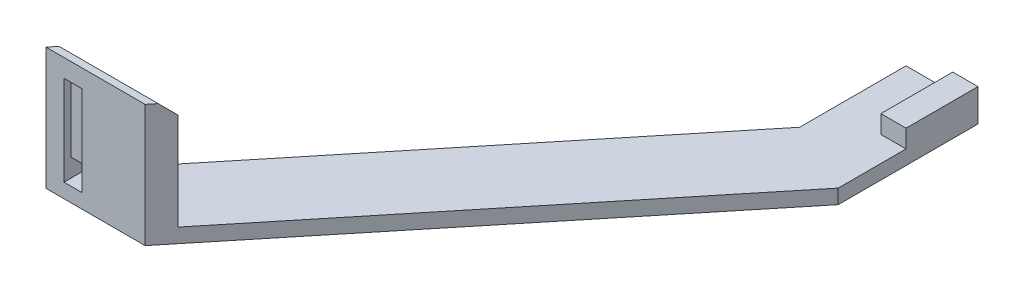
ISO-10303-21;
HEADER;
FILE_DESCRIPTION(('STEP AP214'),'2;1');
FILE_NAME('part.step','',(''),(''),'','','');
FILE_SCHEMA(('AUTOMOTIVE_DESIGN { 1 0 10303 214 1 1 1 1 }'));
ENDSEC;
DATA;
#1=APPLICATION_CONTEXT('core data for automotive mechanical design processes');
#2=APPLICATION_PROTOCOL_DEFINITION('international standard','automotive_design',2000,#1);
#3=PRODUCT_CONTEXT('',#1,'mechanical');
#4=PRODUCT('Part','Part','',(#3));
#5=PRODUCT_RELATED_PRODUCT_CATEGORY('part','',(#4));
#6=PRODUCT_DEFINITION_FORMATION('','',#4);
#7=PRODUCT_DEFINITION_CONTEXT('part definition',#1,'design');
#8=PRODUCT_DEFINITION('design','',#6,#7);
#9=PRODUCT_DEFINITION_SHAPE('','',#8);
#10=(LENGTH_UNIT() NAMED_UNIT(*) SI_UNIT(.MILLI.,.METRE.));
#11=(NAMED_UNIT(*) PLANE_ANGLE_UNIT() SI_UNIT($,.RADIAN.));
#12=(NAMED_UNIT(*) SI_UNIT($,.STERADIAN.) SOLID_ANGLE_UNIT());
#13=UNCERTAINTY_MEASURE_WITH_UNIT(LENGTH_MEASURE(1.E-05),#10,'distance_accuracy_value','');
#14=(GEOMETRIC_REPRESENTATION_CONTEXT(3) GLOBAL_UNCERTAINTY_ASSIGNED_CONTEXT((#13)) GLOBAL_UNIT_ASSIGNED_CONTEXT((#10,
#11,#12)) REPRESENTATION_CONTEXT('',''));
#15=CARTESIAN_POINT('',(0.,0.,0.));
#16=DIRECTION('',(0.,0.,1.));
#17=DIRECTION('',(1.,0.,0.));
#18=AXIS2_PLACEMENT_3D('',#15,#16,#17);
#19=CARTESIAN_POINT('',(-109.,34.,0.));
#20=DIRECTION('',(-1.,0.,0.));
#21=DIRECTION('',(0.,0.,1.));
#22=AXIS2_PLACEMENT_3D('',#19,#20,#21);
#23=PLANE('',#22);
#24=DIRECTION('',(0.,0.,-1.));
#25=VECTOR('',#24,1.);
#26=CARTESIAN_POINT('',(-109.,29.,0.));
#27=LINE('',#26,#25);
#28=CARTESIAN_POINT('',(-109.,29.,0.));
#29=VERTEX_POINT('',#28);
#30=CARTESIAN_POINT('',(-109.,29.,-2.));
#31=VERTEX_POINT('',#30);
#32=EDGE_CURVE('E158',#29,#31,#27,.T.);
#33=ORIENTED_EDGE('',*,*,#32,.F.);
#34=DIRECTION('',(0.,-1.,0.));
#35=VECTOR('',#34,1.);
#36=CARTESIAN_POINT('',(-109.,34.,0.));
#37=LINE('',#36,#35);
#38=CARTESIAN_POINT('',(-109.,4.,0.));
#39=VERTEX_POINT('',#38);
#40=EDGE_CURVE('E169',#29,#39,#37,.T.);
#41=ORIENTED_EDGE('',*,*,#40,.T.);
#42=DIRECTION('',(0.,0.,-1.));
#43=VECTOR('',#42,1.);
#44=CARTESIAN_POINT('',(-109.,4.,0.));
#45=LINE('',#44,#43);
#46=CARTESIAN_POINT('',(-109.,4.,-5.));
#47=VERTEX_POINT('',#46);
#48=EDGE_CURVE('E248',#39,#47,#45,.T.);
#49=ORIENTED_EDGE('',*,*,#48,.T.);
#50=DIRECTION('',(0.,-1.,0.));
#51=VECTOR('',#50,1.);
#52=CARTESIAN_POINT('',(-109.,34.,-5.));
#53=LINE('',#52,#51);
#54=CARTESIAN_POINT('',(-109.,9.,-5.));
#55=VERTEX_POINT('',#54);
#56=EDGE_CURVE('E220',#55,#47,#53,.T.);
#57=ORIENTED_EDGE('',*,*,#56,.F.);
#58=DIRECTION('',(0.,0.,1.));
#59=VECTOR('',#58,1.);
#60=CARTESIAN_POINT('',(-109.,9.,-32.));
#61=LINE('',#60,#59);
#62=CARTESIAN_POINT('',(-109.,9.,-2.));
#63=VERTEX_POINT('',#62);
#64=EDGE_CURVE('E251',#55,#63,#61,.T.);
#65=ORIENTED_EDGE('',*,*,#64,.T.);
#66=DIRECTION('',(0.,-1.,0.));
#67=VECTOR('',#66,1.);
#68=CARTESIAN_POINT('',(-109.,34.,-2.));
#69=LINE('',#68,#67);
#70=EDGE_CURVE('E172',#31,#63,#69,.T.);
#71=ORIENTED_EDGE('',*,*,#70,.F.);
#72=EDGE_LOOP('',(#33,#41,#49,#57,#65,#71));
#73=FACE_BOUND('',#72,.T.);
#74=ADVANCED_FACE('F33',(#73),#23,.F.);
#75=CARTESIAN_POINT('',(-109.,34.,-2.));
#76=DIRECTION('',(0.,0.,-1.));
#77=DIRECTION('',(-1.,0.,0.));
#78=AXIS2_PLACEMENT_3D('',#75,#76,#77);
#79=PLANE('',#78);
#80=DIRECTION('',(1.,0.,0.));
#81=VECTOR('',#80,1.);
#82=CARTESIAN_POINT('',(-104.,29.,-2.));
#83=LINE('',#82,#81);
#84=CARTESIAN_POINT('',(-104.,29.,-2.));
#85=VERTEX_POINT('',#84);
#86=EDGE_CURVE('E165',#31,#85,#83,.T.);
#87=ORIENTED_EDGE('',*,*,#86,.F.);
#88=ORIENTED_EDGE('',*,*,#70,.T.);
#89=DIRECTION('',(-1.,0.,0.));
#90=VECTOR('',#89,1.);
#91=CARTESIAN_POINT('',(-109.,9.,-2.));
#92=LINE('',#91,#90);
#93=CARTESIAN_POINT('',(-104.,9.,-2.));
#94=VERTEX_POINT('',#93);
#95=EDGE_CURVE('E173',#94,#63,#92,.T.);
#96=ORIENTED_EDGE('',*,*,#95,.F.);
#97=DIRECTION('',(0.,-1.,0.));
#98=VECTOR('',#97,1.);
#99=CARTESIAN_POINT('',(-104.,34.,-2.));
#100=LINE('',#99,#98);
#101=EDGE_CURVE('E185',#85,#94,#100,.T.);
#102=ORIENTED_EDGE('',*,*,#101,.F.);
#103=EDGE_LOOP('',(#87,#88,#96,#102));
#104=FACE_BOUND('',#103,.T.);
#105=ADVANCED_FACE('F274',(#104),#79,.F.);
#106=CARTESIAN_POINT('',(-104.,34.,-2.));
#107=DIRECTION('',(1.,0.,0.));
#108=DIRECTION('',(0.,0.,-1.));
#109=AXIS2_PLACEMENT_3D('',#106,#107,#108);
#110=PLANE('',#109);
#111=DIRECTION('',(0.,0.,-1.));
#112=VECTOR('',#111,1.);
#113=CARTESIAN_POINT('',(-104.,29.,0.));
#114=LINE('',#113,#112);
#115=CARTESIAN_POINT('',(-104.,29.,0.));
#116=VERTEX_POINT('',#115);
#117=EDGE_CURVE('E161',#116,#85,#114,.T.);
#118=ORIENTED_EDGE('',*,*,#117,.T.);
#119=ORIENTED_EDGE('',*,*,#101,.T.);
#120=DIRECTION('',(0.,0.,1.));
#121=VECTOR('',#120,1.);
#122=CARTESIAN_POINT('',(-104.,9.,-32.));
#123=LINE('',#122,#121);
#124=CARTESIAN_POINT('',(-104.,9.,-5.));
#125=VERTEX_POINT('',#124);
#126=EDGE_CURVE('E266',#125,#94,#123,.T.);
#127=ORIENTED_EDGE('',*,*,#126,.F.);
#128=DIRECTION('',(0.,1.,0.));
#129=VECTOR('',#128,1.);
#130=CARTESIAN_POINT('',(-104.,34.,-5.));
#131=LINE('',#130,#129);
#132=CARTESIAN_POINT('',(-104.,4.,-5.));
#133=VERTEX_POINT('',#132);
#134=EDGE_CURVE('E213',#133,#125,#131,.T.);
#135=ORIENTED_EDGE('',*,*,#134,.F.);
#136=DIRECTION('',(0.,0.,1.));
#137=VECTOR('',#136,1.);
#138=CARTESIAN_POINT('',(-104.,4.,-2.));
#139=LINE('',#138,#137);
#140=CARTESIAN_POINT('',(-104.,4.,0.));
#141=VERTEX_POINT('',#140);
#142=EDGE_CURVE('E250',#133,#141,#139,.T.);
#143=ORIENTED_EDGE('',*,*,#142,.T.);
#144=DIRECTION('',(0.,-1.,0.));
#145=VECTOR('',#144,1.);
#146=CARTESIAN_POINT('',(-104.,34.,0.));
#147=LINE('',#146,#145);
#148=EDGE_CURVE('E259',#116,#141,#147,.T.);
#149=ORIENTED_EDGE('',*,*,#148,.F.);
#150=EDGE_LOOP('',(#118,#119,#127,#135,#143,#149));
#151=FACE_BOUND('',#150,.T.);
#152=ADVANCED_FACE('F264',(#151),#110,.F.);
#153=CARTESIAN_POINT('',(0.,4.,0.));
#154=DIRECTION('',(0.,-1.,0.));
#155=DIRECTION('',(0.,0.,-1.));
#156=AXIS2_PLACEMENT_3D('',#153,#154,#155);
#157=PLANE('',#156);
#158=DIRECTION('',(-0.631426343209567,0.,0.775435860081925));
#159=VECTOR('',#158,1.);
#160=CARTESIAN_POINT('',(-114.,4.,0.));
#161=LINE('',#160,#159);
#162=CARTESIAN_POINT('',(-20.,4.,-115.438596491228));
#163=VERTEX_POINT('',#162);
#164=CARTESIAN_POINT('',(-109.928571428571,4.,-5.));
#165=VERTEX_POINT('',#164);
#166=EDGE_CURVE('E497',#163,#165,#161,.T.);
#167=ORIENTED_EDGE('',*,*,#166,.T.);
#168=DIRECTION('',(-1.,0.,0.));
#169=VECTOR('',#168,1.);
#170=CARTESIAN_POINT('',(-82.3748336188116,4.,-5.));
#171=LINE('',#170,#169);
#172=EDGE_CURVE('E254',#47,#165,#171,.T.);
#173=ORIENTED_EDGE('',*,*,#172,.F.);
#174=ORIENTED_EDGE('',*,*,#48,.F.);
#175=DIRECTION('',(1.,0.,0.));
#176=VECTOR('',#175,1.);
#177=CARTESIAN_POINT('',(-114.,4.,0.));
#178=LINE('',#177,#176);
#179=EDGE_CURVE('E179',#39,#141,#178,.T.);
#180=ORIENTED_EDGE('',*,*,#179,.T.);
#181=ORIENTED_EDGE('',*,*,#142,.F.);
#182=CARTESIAN_POINT('',(-82.3748336188116,4.,-5.));
#183=VERTEX_POINT('',#182);
#184=EDGE_CURVE('E255',#183,#133,#171,.T.);
#185=ORIENTED_EDGE('',*,*,#184,.F.);
#186=DIRECTION('',(0.631434001711775,0.,-0.775429623810088));
#187=VECTOR('',#186,1.);
#188=CARTESIAN_POINT('',(-86.4463443163861,4.,0.));
#189=LINE('',#188,#187);
#190=CARTESIAN_POINT('',(0.,4.,-106.160035841102));
#191=VERTEX_POINT('',#190);
#192=EDGE_CURVE('E502',#183,#191,#189,.T.);
#193=ORIENTED_EDGE('',*,*,#192,.T.);
#194=DIRECTION('',(0.,0.,-1.));
#195=VECTOR('',#194,1.);
#196=CARTESIAN_POINT('',(0.,4.,-140.));
#197=LINE('',#196,#195);
#198=CARTESIAN_POINT('',(0.,4.,-125.));
#199=VERTEX_POINT('',#198);
#200=EDGE_CURVE('E508',#191,#199,#197,.T.);
#201=ORIENTED_EDGE('',*,*,#200,.T.);
#202=DIRECTION('',(1.,0.,0.));
#203=VECTOR('',#202,1.);
#204=CARTESIAN_POINT('',(0.,4.,-125.));
#205=LINE('',#204,#203);
#206=CARTESIAN_POINT('',(-7.,4.,-125.));
#207=VERTEX_POINT('',#206);
#208=EDGE_CURVE('E183',#207,#199,#205,.T.);
#209=ORIENTED_EDGE('',*,*,#208,.F.);
#210=DIRECTION('',(0.,0.,1.));
#211=VECTOR('',#210,1.);
#212=CARTESIAN_POINT('',(-7.,4.,-145.));
#213=LINE('',#212,#211);
#214=CARTESIAN_POINT('',(-7.,4.,-145.));
#215=VERTEX_POINT('',#214);
#216=EDGE_CURVE('E180',#215,#207,#213,.T.);
#217=ORIENTED_EDGE('',*,*,#216,.F.);
#218=DIRECTION('',(-1.,0.,0.));
#219=VECTOR('',#218,1.);
#220=CARTESIAN_POINT('',(-20.,4.,-145.));
#221=LINE('',#220,#219);
#222=CARTESIAN_POINT('',(-20.,4.,-145.));
#223=VERTEX_POINT('',#222);
#224=EDGE_CURVE('E516',#215,#223,#221,.T.);
#225=ORIENTED_EDGE('',*,*,#224,.T.);
#226=DIRECTION('',(0.,0.,1.));
#227=VECTOR('',#226,1.);
#228=CARTESIAN_POINT('',(-20.,4.,-145.));
#229=LINE('',#228,#227);
#230=EDGE_CURVE('E499',#223,#163,#229,.T.);
#231=ORIENTED_EDGE('',*,*,#230,.T.);
#232=EDGE_LOOP('',(#167,#173,#174,#180,#181,#185,#193,#201,#209,#217,#225,#231));
#233=FACE_BOUND('',#232,.T.);
#234=ADVANCED_FACE('F317',(#233),#157,.F.);
#235=CARTESIAN_POINT('',(-114.,4.,0.));
#236=DIRECTION('',(0.775435860081925,0.,0.631426343209567));
#237=DIRECTION('',(0.631426343209567,0.,-0.775435860081925));
#238=AXIS2_PLACEMENT_3D('',#235,#236,#237);
#239=PLANE('',#238);
#240=DIRECTION('',(-0.631426343209566,0.,0.775435860081925));
#241=VECTOR('',#240,1.);
#242=CARTESIAN_POINT('',(-109.928571428571,34.,-5.));
#243=LINE('',#242,#241);
#244=CARTESIAN_POINT('',(-112.371428571429,34.,-1.99999999999995));
#245=VERTEX_POINT('',#244);
#246=CARTESIAN_POINT('',(-114.,34.,0.));
#247=VERTEX_POINT('',#246);
#248=EDGE_CURVE('E230',#245,#247,#243,.T.);
#249=ORIENTED_EDGE('',*,*,#248,.F.);
#250=DIRECTION('',(0.498983563377396,-0.612786832217861,-0.612786832217856));
#251=VECTOR('',#250,1.);
#252=CARTESIAN_POINT('',(-84.3926737681051,-0.359874319871327,-36.359874319871));
#253=LINE('',#252,#251);
#254=CARTESIAN_POINT('',(-109.928571428571,30.9999999999999,-5.));
#255=VERTEX_POINT('',#254);
#256=EDGE_CURVE('E55',#245,#255,#253,.T.);
#257=ORIENTED_EDGE('',*,*,#256,.T.);
#258=DIRECTION('',(0.,-1.,0.));
#259=VECTOR('',#258,1.);
#260=CARTESIAN_POINT('',(-109.928571428571,34.,-5.));
#261=LINE('',#260,#259);
#262=EDGE_CURVE('E240',#255,#165,#261,.T.);
#263=ORIENTED_EDGE('',*,*,#262,.T.);
#264=ORIENTED_EDGE('',*,*,#166,.F.);
#265=DIRECTION('',(0.,-1.,0.));
#266=VECTOR('',#265,1.);
#267=CARTESIAN_POINT('',(-20.,4.,-115.438596491228));
#268=LINE('',#267,#266);
#269=CARTESIAN_POINT('',(-20.,0.,-115.438596491228));
#270=VERTEX_POINT('',#269);
#271=EDGE_CURVE('E538',#163,#270,#268,.T.);
#272=ORIENTED_EDGE('',*,*,#271,.T.);
#273=DIRECTION('',(-0.631426343209567,0.,0.775435860081925));
#274=VECTOR('',#273,1.);
#275=CARTESIAN_POINT('',(-114.,0.,0.));
#276=LINE('',#275,#274);
#277=CARTESIAN_POINT('',(-114.,0.,0.));
#278=VERTEX_POINT('',#277);
#279=EDGE_CURVE('E521',#270,#278,#276,.T.);
#280=ORIENTED_EDGE('',*,*,#279,.T.);
#281=DIRECTION('',(0.,-1.,0.));
#282=VECTOR('',#281,1.);
#283=CARTESIAN_POINT('',(-114.,4.,0.));
#284=LINE('',#283,#282);
#285=EDGE_CURVE('E217',#247,#278,#284,.T.);
#286=ORIENTED_EDGE('',*,*,#285,.F.);
#287=EDGE_LOOP('',(#249,#257,#263,#264,#272,#280,#286));
#288=FACE_BOUND('',#287,.T.);
#289=ADVANCED_FACE('F236',(#288),#239,.F.);
#290=CARTESIAN_POINT('',(-114.,4.,0.));
#291=DIRECTION('',(0.,0.,-1.));
#292=DIRECTION('',(-1.,0.,0.));
#293=AXIS2_PLACEMENT_3D('',#290,#291,#292);
#294=PLANE('',#293);
#295=ORIENTED_EDGE('',*,*,#40,.F.);
#296=DIRECTION('',(1.,0.,0.));
#297=VECTOR('',#296,1.);
#298=CARTESIAN_POINT('',(-104.,29.,0.));
#299=LINE('',#298,#297);
#300=EDGE_CURVE('E155',#29,#116,#299,.T.);
#301=ORIENTED_EDGE('',*,*,#300,.T.);
#302=ORIENTED_EDGE('',*,*,#148,.T.);
#303=ORIENTED_EDGE('',*,*,#179,.F.);
#304=EDGE_LOOP('',(#295,#301,#302,#303));
#305=FACE_BOUND('',#304,.T.);
#306=DIRECTION('',(1.,0.,0.));
#307=VECTOR('',#306,1.);
#308=CARTESIAN_POINT('',(-114.,0.,0.));
#309=LINE('',#308,#307);
#310=CARTESIAN_POINT('',(-86.4463443163861,0.,0.));
#311=VERTEX_POINT('',#310);
#312=EDGE_CURVE('E281',#278,#311,#309,.T.);
#313=ORIENTED_EDGE('',*,*,#312,.T.);
#314=DIRECTION('',(0.,-1.,0.));
#315=VECTOR('',#314,1.);
#316=CARTESIAN_POINT('',(-86.4463443163861,4.,0.));
#317=LINE('',#316,#315);
#318=CARTESIAN_POINT('',(-86.4463443163861,34.,0.));
#319=VERTEX_POINT('',#318);
#320=EDGE_CURVE('E280',#319,#311,#317,.T.);
#321=ORIENTED_EDGE('',*,*,#320,.F.);
#322=DIRECTION('',(1.,0.,0.));
#323=VECTOR('',#322,1.);
#324=CARTESIAN_POINT('',(-109.,34.,0.));
#325=LINE('',#324,#323);
#326=EDGE_CURVE('E244',#247,#319,#325,.T.);
#327=ORIENTED_EDGE('',*,*,#326,.F.);
#328=ORIENTED_EDGE('',*,*,#285,.T.);
#329=EDGE_LOOP('',(#313,#321,#327,#328));
#330=FACE_BOUND('',#329,.T.);
#331=ADVANCED_FACE('F176',(#305,#330),#294,.F.);
#332=CARTESIAN_POINT('',(-86.4463443163861,4.,0.));
#333=DIRECTION('',(-0.775429623810088,0.,-0.631434001711775));
#334=DIRECTION('',(-0.631434001711775,0.,0.775429623810088));
#335=AXIS2_PLACEMENT_3D('',#332,#333,#334);
#336=PLANE('',#335);
#337=DIRECTION('',(0.,-1.,0.));
#338=VECTOR('',#337,1.);
#339=CARTESIAN_POINT('',(-82.3748336188116,34.,-5.));
#340=LINE('',#339,#338);
#341=CARTESIAN_POINT('',(-82.3748336188116,30.9999999999999,-5.));
#342=VERTEX_POINT('',#341);
#343=EDGE_CURVE('E242',#342,#183,#340,.T.);
#344=ORIENTED_EDGE('',*,*,#343,.F.);
#345=DIRECTION('',(-0.498991122413766,0.612783754579157,0.612783754579151));
#346=VECTOR('',#345,1.);
#347=CARTESIAN_POINT('',(-63.6987894144777,8.06496974764141,-27.9350302523583));
#348=LINE('',#347,#346);
#349=CARTESIAN_POINT('',(-84.8177400373563,34.,-1.99999999999999));
#350=VERTEX_POINT('',#349);
#351=EDGE_CURVE('E11',#342,#350,#348,.T.);
#352=ORIENTED_EDGE('',*,*,#351,.T.);
#353=DIRECTION('',(0.631434001711776,0.,-0.775429623810087));
#354=VECTOR('',#353,1.);
#355=CARTESIAN_POINT('',(-86.4463443163861,34.,0.));
#356=LINE('',#355,#354);
#357=EDGE_CURVE('E233',#319,#350,#356,.T.);
#358=ORIENTED_EDGE('',*,*,#357,.F.);
#359=ORIENTED_EDGE('',*,*,#320,.T.);
#360=DIRECTION('',(0.631434001711775,0.,-0.775429623810088));
#361=VECTOR('',#360,1.);
#362=CARTESIAN_POINT('',(-86.4463443163861,0.,0.));
#363=LINE('',#362,#361);
#364=CARTESIAN_POINT('',(0.,0.,-106.160035841102));
#365=VERTEX_POINT('',#364);
#366=EDGE_CURVE('E543',#311,#365,#363,.T.);
#367=ORIENTED_EDGE('',*,*,#366,.T.);
#368=DIRECTION('',(0.,-1.,0.));
#369=VECTOR('',#368,1.);
#370=CARTESIAN_POINT('',(0.,4.,-106.160035841102));
#371=LINE('',#370,#369);
#372=EDGE_CURVE('E285',#191,#365,#371,.T.);
#373=ORIENTED_EDGE('',*,*,#372,.F.);
#374=ORIENTED_EDGE('',*,*,#192,.F.);
#375=EDGE_LOOP('',(#344,#352,#358,#359,#367,#373,#374));
#376=FACE_BOUND('',#375,.T.);
#377=ADVANCED_FACE('F287',(#376),#336,.F.);
#378=CARTESIAN_POINT('',(0.,4.,-145.));
#379=DIRECTION('',(-1.,0.,0.));
#380=DIRECTION('',(0.,0.,1.));
#381=AXIS2_PLACEMENT_3D('',#378,#379,#380);
#382=PLANE('',#381);
#383=DIRECTION('',(0.,0.,-1.));
#384=VECTOR('',#383,1.);
#385=CARTESIAN_POINT('',(0.,0.,-145.));
#386=LINE('',#385,#384);
#387=CARTESIAN_POINT('',(0.,0.,-145.));
#388=VERTEX_POINT('',#387);
#389=EDGE_CURVE('E545',#365,#388,#386,.T.);
#390=ORIENTED_EDGE('',*,*,#389,.T.);
#391=DIRECTION('',(0.,-1.,0.));
#392=VECTOR('',#391,1.);
#393=CARTESIAN_POINT('',(0.,4.,-145.));
#394=LINE('',#393,#392);
#395=CARTESIAN_POINT('',(0.,9.,-145.));
#396=VERTEX_POINT('',#395);
#397=EDGE_CURVE('E537',#396,#388,#394,.T.);
#398=ORIENTED_EDGE('',*,*,#397,.F.);
#399=DIRECTION('',(0.,0.,-1.));
#400=VECTOR('',#399,1.);
#401=CARTESIAN_POINT('',(0.,9.,-145.));
#402=LINE('',#401,#400);
#403=CARTESIAN_POINT('',(0.,9.,-125.));
#404=VERTEX_POINT('',#403);
#405=EDGE_CURVE('E189',#404,#396,#402,.T.);
#406=ORIENTED_EDGE('',*,*,#405,.F.);
#407=DIRECTION('',(0.,-1.,0.));
#408=VECTOR('',#407,1.);
#409=CARTESIAN_POINT('',(0.,9.,-125.));
#410=LINE('',#409,#408);
#411=EDGE_CURVE('E198',#404,#199,#410,.T.);
#412=ORIENTED_EDGE('',*,*,#411,.T.);
#413=ORIENTED_EDGE('',*,*,#200,.F.);
#414=ORIENTED_EDGE('',*,*,#372,.T.);
#415=EDGE_LOOP('',(#390,#398,#406,#412,#413,#414));
#416=FACE_BOUND('',#415,.T.);
#417=ADVANCED_FACE('F331',(#416),#382,.F.);
#418=CARTESIAN_POINT('',(-20.,4.,-145.));
#419=DIRECTION('',(0.,0.,1.));
#420=DIRECTION('',(1.,0.,0.));
#421=AXIS2_PLACEMENT_3D('',#418,#419,#420);
#422=PLANE('',#421);
#423=DIRECTION('',(-1.,0.,0.));
#424=VECTOR('',#423,1.);
#425=CARTESIAN_POINT('',(-20.,0.,-145.));
#426=LINE('',#425,#424);
#427=CARTESIAN_POINT('',(-20.,0.,-145.));
#428=VERTEX_POINT('',#427);
#429=EDGE_CURVE('E504',#388,#428,#426,.T.);
#430=ORIENTED_EDGE('',*,*,#429,.T.);
#431=DIRECTION('',(0.,-1.,0.));
#432=VECTOR('',#431,1.);
#433=CARTESIAN_POINT('',(-20.,4.,-145.));
#434=LINE('',#433,#432);
#435=EDGE_CURVE('E533',#223,#428,#434,.T.);
#436=ORIENTED_EDGE('',*,*,#435,.F.);
#437=ORIENTED_EDGE('',*,*,#224,.F.);
#438=DIRECTION('',(0.,-1.,0.));
#439=VECTOR('',#438,1.);
#440=CARTESIAN_POINT('',(-7.,9.,-145.));
#441=LINE('',#440,#439);
#442=CARTESIAN_POINT('',(-7.,9.,-145.));
#443=VERTEX_POINT('',#442);
#444=EDGE_CURVE('E519',#443,#215,#441,.T.);
#445=ORIENTED_EDGE('',*,*,#444,.F.);
#446=DIRECTION('',(-1.,0.,0.));
#447=VECTOR('',#446,1.);
#448=CARTESIAN_POINT('',(0.,9.,-145.));
#449=LINE('',#448,#447);
#450=EDGE_CURVE('E192',#396,#443,#449,.T.);
#451=ORIENTED_EDGE('',*,*,#450,.F.);
#452=ORIENTED_EDGE('',*,*,#397,.T.);
#453=EDGE_LOOP('',(#430,#436,#437,#445,#451,#452));
#454=FACE_BOUND('',#453,.T.);
#455=ADVANCED_FACE('F327',(#454),#422,.F.);
#456=CARTESIAN_POINT('',(-20.,4.,-145.));
#457=DIRECTION('',(1.,0.,0.));
#458=DIRECTION('',(0.,0.,-1.));
#459=AXIS2_PLACEMENT_3D('',#456,#457,#458);
#460=PLANE('',#459);
#461=DIRECTION('',(0.,0.,1.));
#462=VECTOR('',#461,1.);
#463=CARTESIAN_POINT('',(-20.,0.,-145.));
#464=LINE('',#463,#462);
#465=EDGE_CURVE('E501',#428,#270,#464,.T.);
#466=ORIENTED_EDGE('',*,*,#465,.T.);
#467=ORIENTED_EDGE('',*,*,#271,.F.);
#468=ORIENTED_EDGE('',*,*,#230,.F.);
#469=ORIENTED_EDGE('',*,*,#435,.T.);
#470=EDGE_LOOP('',(#466,#467,#468,#469));
#471=FACE_BOUND('',#470,.T.);
#472=ADVANCED_FACE('F323',(#471),#460,.F.);
#473=CARTESIAN_POINT('',(0.,0.,0.));
#474=DIRECTION('',(0.,-1.,0.));
#475=DIRECTION('',(0.,0.,-1.));
#476=AXIS2_PLACEMENT_3D('',#473,#474,#475);
#477=PLANE('',#476);
#478=ORIENTED_EDGE('',*,*,#279,.F.);
#479=ORIENTED_EDGE('',*,*,#465,.F.);
#480=ORIENTED_EDGE('',*,*,#429,.F.);
#481=ORIENTED_EDGE('',*,*,#389,.F.);
#482=ORIENTED_EDGE('',*,*,#366,.F.);
#483=ORIENTED_EDGE('',*,*,#312,.F.);
#484=EDGE_LOOP('',(#478,#479,#480,#481,#482,#483));
#485=FACE_BOUND('',#484,.T.);
#486=ADVANCED_FACE('F315',(#485),#477,.T.);
#487=CARTESIAN_POINT('',(-7.,9.,-145.));
#488=DIRECTION('',(1.,0.,0.));
#489=DIRECTION('',(0.,0.,-1.));
#490=AXIS2_PLACEMENT_3D('',#487,#488,#489);
#491=PLANE('',#490);
#492=ORIENTED_EDGE('',*,*,#216,.T.);
#493=DIRECTION('',(0.,-1.,0.));
#494=VECTOR('',#493,1.);
#495=CARTESIAN_POINT('',(-7.,9.,-125.));
#496=LINE('',#495,#494);
#497=CARTESIAN_POINT('',(-7.,9.,-125.));
#498=VERTEX_POINT('',#497);
#499=EDGE_CURVE('E201',#498,#207,#496,.T.);
#500=ORIENTED_EDGE('',*,*,#499,.F.);
#501=DIRECTION('',(0.,0.,1.));
#502=VECTOR('',#501,1.);
#503=CARTESIAN_POINT('',(-7.,9.,-145.));
#504=LINE('',#503,#502);
#505=EDGE_CURVE('E194',#443,#498,#504,.T.);
#506=ORIENTED_EDGE('',*,*,#505,.F.);
#507=ORIENTED_EDGE('',*,*,#444,.T.);
#508=EDGE_LOOP('',(#492,#500,#506,#507));
#509=FACE_BOUND('',#508,.T.);
#510=ADVANCED_FACE('F311',(#509),#491,.F.);
#511=CARTESIAN_POINT('',(0.,9.,-125.));
#512=DIRECTION('',(0.,0.,-1.));
#513=DIRECTION('',(-1.,0.,0.));
#514=AXIS2_PLACEMENT_3D('',#511,#512,#513);
#515=PLANE('',#514);
#516=ORIENTED_EDGE('',*,*,#208,.T.);
#517=ORIENTED_EDGE('',*,*,#411,.F.);
#518=DIRECTION('',(1.,0.,0.));
#519=VECTOR('',#518,1.);
#520=CARTESIAN_POINT('',(0.,9.,-125.));
#521=LINE('',#520,#519);
#522=EDGE_CURVE('E196',#498,#404,#521,.T.);
#523=ORIENTED_EDGE('',*,*,#522,.F.);
#524=ORIENTED_EDGE('',*,*,#499,.T.);
#525=EDGE_LOOP('',(#516,#517,#523,#524));
#526=FACE_BOUND('',#525,.T.);
#527=ADVANCED_FACE('F307',(#526),#515,.F.);
#528=CARTESIAN_POINT('',(0.,9.,0.));
#529=DIRECTION('',(0.,-1.,0.));
#530=DIRECTION('',(0.,0.,-1.));
#531=AXIS2_PLACEMENT_3D('',#528,#529,#530);
#532=PLANE('',#531);
#533=ORIENTED_EDGE('',*,*,#405,.T.);
#534=ORIENTED_EDGE('',*,*,#450,.T.);
#535=ORIENTED_EDGE('',*,*,#505,.T.);
#536=ORIENTED_EDGE('',*,*,#522,.T.);
#537=EDGE_LOOP('',(#533,#534,#535,#536));
#538=FACE_BOUND('',#537,.T.);
#539=ADVANCED_FACE('F303',(#538),#532,.F.);
#540=CARTESIAN_POINT('',(-82.3748336188116,34.,-5.));
#541=DIRECTION('',(0.,0.,1.));
#542=DIRECTION('',(1.,0.,0.));
#543=AXIS2_PLACEMENT_3D('',#540,#541,#542);
#544=PLANE('',#543);
#545=ORIENTED_EDGE('',*,*,#262,.F.);
#546=DIRECTION('',(1.,0.,0.));
#547=VECTOR('',#546,1.);
#548=CARTESIAN_POINT('',(-82.3748336188116,30.9999999999999,-5.));
#549=LINE('',#548,#547);
#550=EDGE_CURVE('E41',#255,#342,#549,.T.);
#551=ORIENTED_EDGE('',*,*,#550,.T.);
#552=ORIENTED_EDGE('',*,*,#343,.T.);
#553=ORIENTED_EDGE('',*,*,#184,.T.);
#554=ORIENTED_EDGE('',*,*,#134,.T.);
#555=DIRECTION('',(-1.,0.,0.));
#556=VECTOR('',#555,1.);
#557=CARTESIAN_POINT('',(-82.3748336188116,9.,-5.));
#558=LINE('',#557,#556);
#559=EDGE_CURVE('E216',#125,#55,#558,.T.);
#560=ORIENTED_EDGE('',*,*,#559,.T.);
#561=ORIENTED_EDGE('',*,*,#56,.T.);
#562=ORIENTED_EDGE('',*,*,#172,.T.);
#563=EDGE_LOOP('',(#545,#551,#552,#553,#554,#560,#561,#562));
#564=FACE_BOUND('',#563,.T.);
#565=ADVANCED_FACE('F306',(#564),#544,.F.);
#566=CARTESIAN_POINT('',(0.,34.,0.));
#567=DIRECTION('',(0.,1.,0.));
#568=DIRECTION('',(0.,0.,1.));
#569=AXIS2_PLACEMENT_3D('',#566,#567,#568);
#570=PLANE('',#569);
#571=ORIENTED_EDGE('',*,*,#357,.T.);
#572=DIRECTION('',(-1.,0.,0.));
#573=VECTOR('',#572,1.);
#574=CARTESIAN_POINT('',(-109.928571428571,34.,-1.99999999999997));
#575=LINE('',#574,#573);
#576=EDGE_CURVE('E223',#350,#245,#575,.T.);
#577=ORIENTED_EDGE('',*,*,#576,.T.);
#578=ORIENTED_EDGE('',*,*,#248,.T.);
#579=ORIENTED_EDGE('',*,*,#326,.T.);
#580=EDGE_LOOP('',(#571,#577,#578,#579));
#581=FACE_BOUND('',#580,.T.);
#582=ADVANCED_FACE('F229',(#581),#570,.T.);
#583=CARTESIAN_POINT('',(-109.,9.,-32.));
#584=DIRECTION('',(0.,1.,0.));
#585=DIRECTION('',(0.,0.,1.));
#586=AXIS2_PLACEMENT_3D('',#583,#584,#585);
#587=PLANE('',#586);
#588=ORIENTED_EDGE('',*,*,#126,.T.);
#589=ORIENTED_EDGE('',*,*,#95,.T.);
#590=ORIENTED_EDGE('',*,*,#64,.F.);
#591=ORIENTED_EDGE('',*,*,#559,.F.);
#592=EDGE_LOOP('',(#588,#589,#590,#591));
#593=FACE_BOUND('',#592,.T.);
#594=ADVANCED_FACE('F271',(#593),#587,.F.);
#595=CARTESIAN_POINT('',(-104.,29.,0.));
#596=DIRECTION('',(0.,1.,0.));
#597=DIRECTION('',(0.,0.,1.));
#598=AXIS2_PLACEMENT_3D('',#595,#596,#597);
#599=PLANE('',#598);
#600=ORIENTED_EDGE('',*,*,#86,.T.);
#601=ORIENTED_EDGE('',*,*,#117,.F.);
#602=ORIENTED_EDGE('',*,*,#300,.F.);
#603=ORIENTED_EDGE('',*,*,#32,.T.);
#604=EDGE_LOOP('',(#600,#601,#602,#603));
#605=FACE_BOUND('',#604,.T.);
#606=ADVANCED_FACE('F157',(#605),#599,.F.);
#607=CARTESIAN_POINT('',(0.,34.,-1.99999999999998));
#608=DIRECTION('',(0.,0.707106781186544,-0.707106781186551));
#609=DIRECTION('',(1.,0.,0.));
#610=AXIS2_PLACEMENT_3D('',#607,#608,#609);
#611=PLANE('',#610);
#612=ORIENTED_EDGE('',*,*,#351,.F.);
#613=ORIENTED_EDGE('',*,*,#550,.F.);
#614=ORIENTED_EDGE('',*,*,#256,.F.);
#615=ORIENTED_EDGE('',*,*,#576,.F.);
#616=EDGE_LOOP('',(#612,#613,#614,#615));
#617=FACE_BOUND('',#616,.T.);
#618=ADVANCED_FACE('F35',(#617),#611,.T.);
#619=CLOSED_SHELL('',(#74,#105,#152,#234,#289,#331,#377,#417,#455,#472,#486,#510,#527,#539,#565,
#582,#594,#606,#618));
#620=MANIFOLD_SOLID_BREP('B2',#619);
#621=ADVANCED_BREP_SHAPE_REPRESENTATION('',(#18,#620),#14);
#622=SHAPE_DEFINITION_REPRESENTATION(#9,#621);
ENDSEC;
END-ISO-10303-21;
